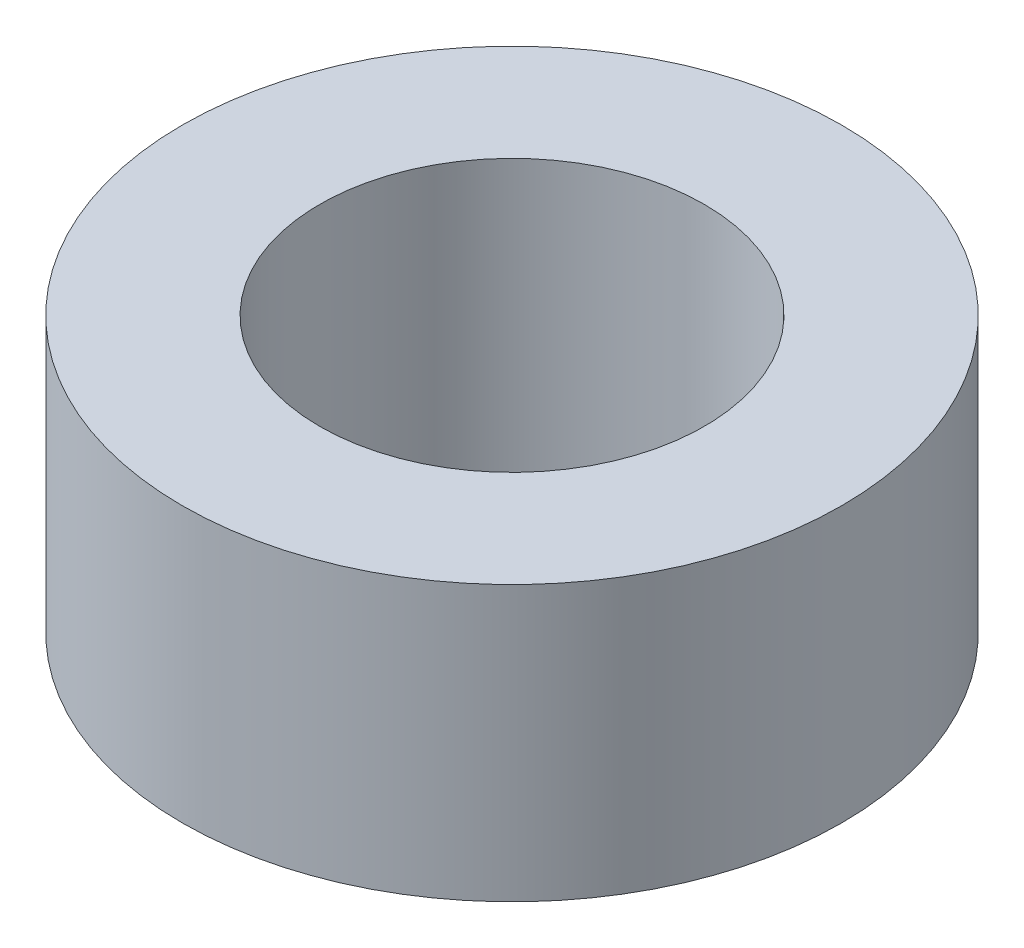
ISO-10303-21;
HEADER;
FILE_DESCRIPTION(('STEP AP214'),'2;1');
FILE_NAME('part.step','',(''),(''),'','','');
FILE_SCHEMA(('AUTOMOTIVE_DESIGN { 1 0 10303 214 1 1 1 1 }'));
ENDSEC;
DATA;
#1=APPLICATION_CONTEXT('core data for automotive mechanical design processes');
#2=APPLICATION_PROTOCOL_DEFINITION('international standard','automotive_design',2000,#1);
#3=PRODUCT_CONTEXT('',#1,'mechanical');
#4=PRODUCT('Part','Part','',(#3));
#5=PRODUCT_RELATED_PRODUCT_CATEGORY('part','',(#4));
#6=PRODUCT_DEFINITION_FORMATION('','',#4);
#7=PRODUCT_DEFINITION_CONTEXT('part definition',#1,'design');
#8=PRODUCT_DEFINITION('design','',#6,#7);
#9=PRODUCT_DEFINITION_SHAPE('','',#8);
#10=(LENGTH_UNIT() NAMED_UNIT(*) SI_UNIT(.MILLI.,.METRE.));
#11=(NAMED_UNIT(*) PLANE_ANGLE_UNIT() SI_UNIT($,.RADIAN.));
#12=(NAMED_UNIT(*) SI_UNIT($,.STERADIAN.) SOLID_ANGLE_UNIT());
#13=UNCERTAINTY_MEASURE_WITH_UNIT(LENGTH_MEASURE(1.E-05),#10,'distance_accuracy_value','');
#14=(GEOMETRIC_REPRESENTATION_CONTEXT(3) GLOBAL_UNCERTAINTY_ASSIGNED_CONTEXT((#13)) GLOBAL_UNIT_ASSIGNED_CONTEXT((#10,
#11,#12)) REPRESENTATION_CONTEXT('',''));
#15=CARTESIAN_POINT('',(0.,0.,0.));
#16=DIRECTION('',(0.,0.,1.));
#17=DIRECTION('',(1.,0.,0.));
#18=AXIS2_PLACEMENT_3D('',#15,#16,#17);
#19=CARTESIAN_POINT('',(0.,5.,0.));
#20=DIRECTION('',(0.,1.,0.));
#21=DIRECTION('',(0.,0.,1.));
#22=AXIS2_PLACEMENT_3D('',#19,#20,#21);
#23=PLANE('',#22);
#24=CARTESIAN_POINT('',(0.,5.,0.));
#25=DIRECTION('',(0.,1.,0.));
#26=DIRECTION('',(0.,0.,1.));
#27=AXIS2_PLACEMENT_3D('',#24,#25,#26);
#28=CIRCLE('',#27,6.);
#29=CARTESIAN_POINT('',(0.,5.,6.));
#30=VERTEX_POINT('',#29);
#31=EDGE_CURVE('E10',#30,#30,#28,.T.);
#32=ORIENTED_EDGE('',*,*,#31,.T.);
#33=EDGE_LOOP('',(#32));
#34=FACE_BOUND('',#33,.T.);
#35=CARTESIAN_POINT('',(0.,5.,0.));
#36=DIRECTION('',(0.,1.,0.));
#37=DIRECTION('',(0.,0.,1.));
#38=AXIS2_PLACEMENT_3D('',#35,#36,#37);
#39=CIRCLE('',#38,3.5);
#40=CARTESIAN_POINT('',(0.,5.,3.5));
#41=VERTEX_POINT('',#40);
#42=EDGE_CURVE('E41',#41,#41,#39,.T.);
#43=ORIENTED_EDGE('',*,*,#42,.F.);
#44=EDGE_LOOP('',(#43));
#45=FACE_BOUND('',#44,.T.);
#46=ADVANCED_FACE('F30',(#34,#45),#23,.T.);
#47=CARTESIAN_POINT('',(0.,0.,0.));
#48=DIRECTION('',(0.,1.,0.));
#49=DIRECTION('',(0.,0.,1.));
#50=AXIS2_PLACEMENT_3D('',#47,#48,#49);
#51=PLANE('',#50);
#52=CARTESIAN_POINT('',(0.,0.,0.));
#53=DIRECTION('',(0.,1.,0.));
#54=DIRECTION('',(0.,0.,1.));
#55=AXIS2_PLACEMENT_3D('',#52,#53,#54);
#56=CIRCLE('',#55,6.);
#57=CARTESIAN_POINT('',(0.,0.,6.));
#58=VERTEX_POINT('',#57);
#59=EDGE_CURVE('E34',#58,#58,#56,.T.);
#60=ORIENTED_EDGE('',*,*,#59,.F.);
#61=EDGE_LOOP('',(#60));
#62=FACE_BOUND('',#61,.T.);
#63=CARTESIAN_POINT('',(0.,0.,0.));
#64=DIRECTION('',(0.,1.,0.));
#65=DIRECTION('',(0.,0.,1.));
#66=AXIS2_PLACEMENT_3D('',#63,#64,#65);
#67=CIRCLE('',#66,3.5);
#68=CARTESIAN_POINT('',(0.,0.,3.5));
#69=VERTEX_POINT('',#68);
#70=EDGE_CURVE('E43',#69,#69,#67,.T.);
#71=ORIENTED_EDGE('',*,*,#70,.T.);
#72=EDGE_LOOP('',(#71));
#73=FACE_BOUND('',#72,.T.);
#74=ADVANCED_FACE('F53',(#62,#73),#51,.F.);
#75=CARTESIAN_POINT('',(0.,5.,0.));
#76=DIRECTION('',(0.,-1.,0.));
#77=DIRECTION('',(0.,0.,-1.));
#78=AXIS2_PLACEMENT_3D('',#75,#76,#77);
#79=CYLINDRICAL_SURFACE('',#78,6.);
#80=ORIENTED_EDGE('',*,*,#31,.F.);
#81=EDGE_LOOP('',(#80));
#82=FACE_BOUND('',#81,.T.);
#83=ORIENTED_EDGE('',*,*,#59,.T.);
#84=EDGE_LOOP('',(#83));
#85=FACE_BOUND('',#84,.T.);
#86=ADVANCED_FACE('F32',(#82,#85),#79,.T.);
#87=CARTESIAN_POINT('',(0.,5.,0.));
#88=DIRECTION('',(0.,-1.,0.));
#89=DIRECTION('',(0.,0.,-1.));
#90=AXIS2_PLACEMENT_3D('',#87,#88,#89);
#91=CYLINDRICAL_SURFACE('',#90,3.5);
#92=ORIENTED_EDGE('',*,*,#42,.T.);
#93=EDGE_LOOP('',(#92));
#94=FACE_BOUND('',#93,.T.);
#95=ORIENTED_EDGE('',*,*,#70,.F.);
#96=EDGE_LOOP('',(#95));
#97=FACE_BOUND('',#96,.T.);
#98=ADVANCED_FACE('F49',(#94,#97),#91,.F.);
#99=CLOSED_SHELL('',(#46,#74,#86,#98));
#100=MANIFOLD_SOLID_BREP('B2',#99);
#101=ADVANCED_BREP_SHAPE_REPRESENTATION('',(#18,#100),#14);
#102=SHAPE_DEFINITION_REPRESENTATION(#9,#101);
ENDSEC;
END-ISO-10303-21;
